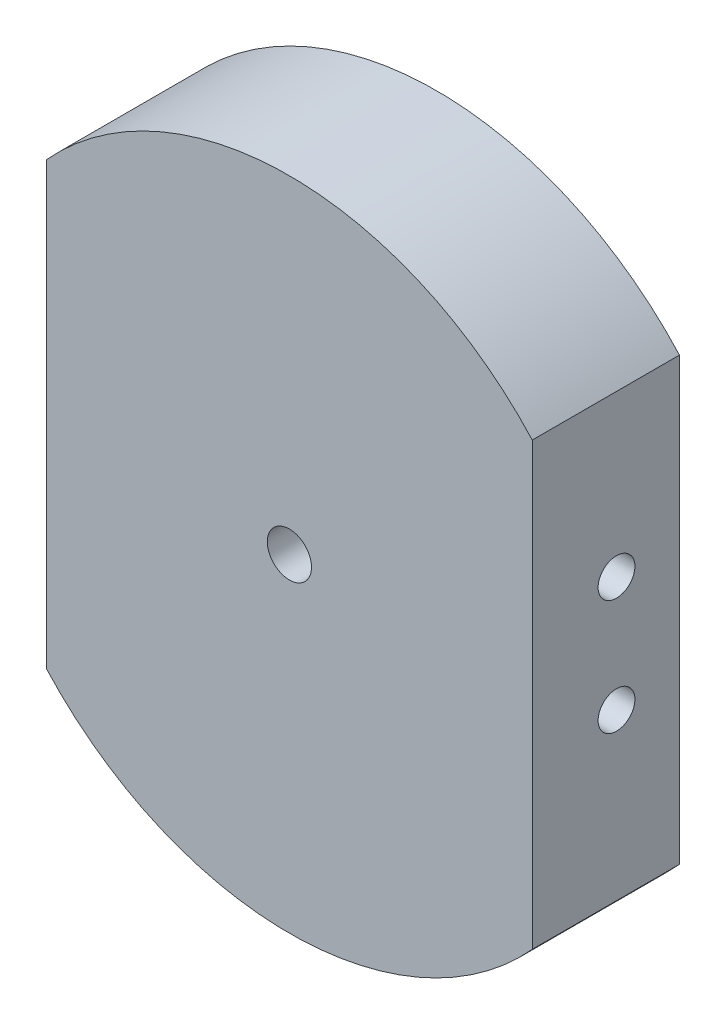
ISO-10303-21;
HEADER;
FILE_DESCRIPTION(('STEP AP214'),'2;1');
FILE_NAME('part.step','',(''),(''),'','','');
FILE_SCHEMA(('AUTOMOTIVE_DESIGN { 1 0 10303 214 1 1 1 1 }'));
ENDSEC;
DATA;
#1=APPLICATION_CONTEXT('core data for automotive mechanical design processes');
#2=APPLICATION_PROTOCOL_DEFINITION('international standard','automotive_design',2000,#1);
#3=PRODUCT_CONTEXT('',#1,'mechanical');
#4=PRODUCT('Part','Part','',(#3));
#5=PRODUCT_RELATED_PRODUCT_CATEGORY('part','',(#4));
#6=PRODUCT_DEFINITION_FORMATION('','',#4);
#7=PRODUCT_DEFINITION_CONTEXT('part definition',#1,'design');
#8=PRODUCT_DEFINITION('design','',#6,#7);
#9=PRODUCT_DEFINITION_SHAPE('','',#8);
#10=(LENGTH_UNIT() NAMED_UNIT(*) SI_UNIT(.MILLI.,.METRE.));
#11=(NAMED_UNIT(*) PLANE_ANGLE_UNIT() SI_UNIT($,.RADIAN.));
#12=(NAMED_UNIT(*) SI_UNIT($,.STERADIAN.) SOLID_ANGLE_UNIT());
#13=UNCERTAINTY_MEASURE_WITH_UNIT(LENGTH_MEASURE(1.E-05),#10,'distance_accuracy_value','');
#14=(GEOMETRIC_REPRESENTATION_CONTEXT(3) GLOBAL_UNCERTAINTY_ASSIGNED_CONTEXT((#13)) GLOBAL_UNIT_ASSIGNED_CONTEXT((#10,
#11,#12)) REPRESENTATION_CONTEXT('',''));
#15=CARTESIAN_POINT('',(0.,0.,0.));
#16=DIRECTION('',(0.,0.,1.));
#17=DIRECTION('',(1.,0.,0.));
#18=AXIS2_PLACEMENT_3D('',#15,#16,#17);
#19=CARTESIAN_POINT('',(0.,0.,0.));
#20=DIRECTION('',(0.,0.,1.));
#21=DIRECTION('',(1.,0.,0.));
#22=AXIS2_PLACEMENT_3D('',#19,#20,#21);
#23=PLANE('',#22);
#24=CARTESIAN_POINT('',(0.,0.,0.));
#25=DIRECTION('',(0.,0.,1.));
#26=DIRECTION('',(1.,0.,0.));
#27=AXIS2_PLACEMENT_3D('',#24,#25,#26);
#28=CIRCLE('',#27,3.);
#29=CARTESIAN_POINT('',(3.,0.,0.));
#30=VERTEX_POINT('',#29);
#31=EDGE_CURVE('E98',#30,#30,#28,.T.);
#32=ORIENTED_EDGE('',*,*,#31,.T.);
#33=EDGE_LOOP('',(#32));
#34=FACE_BOUND('',#33,.T.);
#35=CARTESIAN_POINT('',(0.,0.,0.));
#36=DIRECTION('',(0.,0.,1.));
#37=DIRECTION('',(1.,0.,0.));
#38=AXIS2_PLACEMENT_3D('',#35,#36,#37);
#39=CIRCLE('',#38,44.5764398015129);
#40=CARTESIAN_POINT('',(-33.,-29.9676322951597,0.));
#41=VERTEX_POINT('',#40);
#42=CARTESIAN_POINT('',(33.,-29.9676322951597,0.));
#43=VERTEX_POINT('',#42);
#44=EDGE_CURVE('E84',#41,#43,#39,.T.);
#45=ORIENTED_EDGE('',*,*,#44,.F.);
#46=DIRECTION('',(0.,-1.,0.));
#47=VECTOR('',#46,1.);
#48=CARTESIAN_POINT('',(-33.,0.,0.));
#49=LINE('',#48,#47);
#50=CARTESIAN_POINT('',(-33.,29.9676322951597,0.));
#51=VERTEX_POINT('',#50);
#52=EDGE_CURVE('E75',#51,#41,#49,.T.);
#53=ORIENTED_EDGE('',*,*,#52,.F.);
#54=CARTESIAN_POINT('',(0.,0.,0.));
#55=DIRECTION('',(0.,0.,1.));
#56=DIRECTION('',(1.,0.,0.));
#57=AXIS2_PLACEMENT_3D('',#54,#55,#56);
#58=CIRCLE('',#57,44.5764398015129);
#59=CARTESIAN_POINT('',(33.,29.9676322951597,0.));
#60=VERTEX_POINT('',#59);
#61=EDGE_CURVE('E83',#60,#51,#58,.T.);
#62=ORIENTED_EDGE('',*,*,#61,.F.);
#63=DIRECTION('',(0.,-1.,0.));
#64=VECTOR('',#63,1.);
#65=CARTESIAN_POINT('',(33.,0.,0.));
#66=LINE('',#65,#64);
#67=EDGE_CURVE('E56',#60,#43,#66,.T.);
#68=ORIENTED_EDGE('',*,*,#67,.T.);
#69=EDGE_LOOP('',(#45,#53,#62,#68));
#70=FACE_BOUND('',#69,.T.);
#71=ADVANCED_FACE('F33',(#34,#70),#23,.F.);
#72=CARTESIAN_POINT('',(0.,0.,20.));
#73=DIRECTION('',(0.,0.,1.));
#74=DIRECTION('',(1.,0.,0.));
#75=AXIS2_PLACEMENT_3D('',#72,#73,#74);
#76=PLANE('',#75);
#77=DIRECTION('',(0.,1.,0.));
#78=VECTOR('',#77,1.);
#79=CARTESIAN_POINT('',(-33.,0.,20.));
#80=LINE('',#79,#78);
#81=CARTESIAN_POINT('',(-33.,-29.9676322951597,20.));
#82=VERTEX_POINT('',#81);
#83=CARTESIAN_POINT('',(-33.,29.9676322951598,20.));
#84=VERTEX_POINT('',#83);
#85=EDGE_CURVE('E49',#82,#84,#80,.T.);
#86=ORIENTED_EDGE('',*,*,#85,.F.);
#87=CARTESIAN_POINT('',(0.,0.,20.));
#88=DIRECTION('',(0.,0.,1.));
#89=DIRECTION('',(1.,0.,0.));
#90=AXIS2_PLACEMENT_3D('',#87,#88,#89);
#91=CIRCLE('',#90,44.5764398015129);
#92=CARTESIAN_POINT('',(33.,-29.9676322951597,20.));
#93=VERTEX_POINT('',#92);
#94=EDGE_CURVE('E91',#82,#93,#91,.T.);
#95=ORIENTED_EDGE('',*,*,#94,.T.);
#96=DIRECTION('',(0.,1.,0.));
#97=VECTOR('',#96,1.);
#98=CARTESIAN_POINT('',(33.,0.,20.));
#99=LINE('',#98,#97);
#100=CARTESIAN_POINT('',(33.,29.9676322951597,20.));
#101=VERTEX_POINT('',#100);
#102=EDGE_CURVE('E93',#93,#101,#99,.T.);
#103=ORIENTED_EDGE('',*,*,#102,.T.);
#104=CARTESIAN_POINT('',(0.,0.,20.));
#105=DIRECTION('',(0.,0.,1.));
#106=DIRECTION('',(1.,0.,0.));
#107=AXIS2_PLACEMENT_3D('',#104,#105,#106);
#108=CIRCLE('',#107,44.5764398015129);
#109=EDGE_CURVE('E89',#84,#101,#108,.F.);
#110=ORIENTED_EDGE('',*,*,#109,.F.);
#111=EDGE_LOOP('',(#86,#95,#103,#110));
#112=FACE_BOUND('',#111,.T.);
#113=CARTESIAN_POINT('',(0.,0.,20.));
#114=DIRECTION('',(0.,0.,1.));
#115=DIRECTION('',(1.,0.,0.));
#116=AXIS2_PLACEMENT_3D('',#113,#114,#115);
#117=CIRCLE('',#116,3.);
#118=CARTESIAN_POINT('',(3.,0.,20.));
#119=VERTEX_POINT('',#118);
#120=EDGE_CURVE('E99',#119,#119,#117,.T.);
#121=ORIENTED_EDGE('',*,*,#120,.F.);
#122=EDGE_LOOP('',(#121));
#123=FACE_BOUND('',#122,.T.);
#124=ADVANCED_FACE('F123',(#112,#123),#76,.T.);
#125=CARTESIAN_POINT('',(0.,0.,10.));
#126=DIRECTION('',(0.,0.,1.));
#127=DIRECTION('',(1.,0.,0.));
#128=AXIS2_PLACEMENT_3D('',#125,#126,#127);
#129=CYLINDRICAL_SURFACE('',#128,44.5764398015129);
#130=DIRECTION('',(0.,0.,-1.));
#131=VECTOR('',#130,1.);
#132=CARTESIAN_POINT('',(-33.,-29.9676322951597,58.));
#133=LINE('',#132,#131);
#134=EDGE_CURVE('E85',#82,#41,#133,.T.);
#135=ORIENTED_EDGE('',*,*,#134,.T.);
#136=ORIENTED_EDGE('',*,*,#44,.T.);
#137=DIRECTION('',(0.,0.,-1.));
#138=VECTOR('',#137,1.);
#139=CARTESIAN_POINT('',(33.,-29.9676322951597,58.));
#140=LINE('',#139,#138);
#141=EDGE_CURVE('E119',#93,#43,#140,.T.);
#142=ORIENTED_EDGE('',*,*,#141,.F.);
#143=ORIENTED_EDGE('',*,*,#94,.F.);
#144=EDGE_LOOP('',(#135,#136,#142,#143));
#145=FACE_BOUND('',#144,.T.);
#146=ADVANCED_FACE('F129',(#145),#129,.T.);
#147=CARTESIAN_POINT('',(0.,0.,10.));
#148=DIRECTION('',(0.,0.,1.));
#149=DIRECTION('',(1.,0.,0.));
#150=AXIS2_PLACEMENT_3D('',#147,#148,#149);
#151=CYLINDRICAL_SURFACE('',#150,44.5764398015129);
#152=ORIENTED_EDGE('',*,*,#61,.T.);
#153=DIRECTION('',(0.,0.,1.));
#154=VECTOR('',#153,1.);
#155=CARTESIAN_POINT('',(-33.,29.9676322951598,10.));
#156=LINE('',#155,#154);
#157=EDGE_CURVE('E11',#51,#84,#156,.T.);
#158=ORIENTED_EDGE('',*,*,#157,.T.);
#159=ORIENTED_EDGE('',*,*,#109,.T.);
#160=DIRECTION('',(0.,0.,1.));
#161=VECTOR('',#160,1.);
#162=CARTESIAN_POINT('',(33.,29.9676322951598,10.));
#163=LINE('',#162,#161);
#164=EDGE_CURVE('E41',#60,#101,#163,.T.);
#165=ORIENTED_EDGE('',*,*,#164,.F.);
#166=EDGE_LOOP('',(#152,#158,#159,#165));
#167=FACE_BOUND('',#166,.T.);
#168=ADVANCED_FACE('F88',(#167),#151,.T.);
#169=CARTESIAN_POINT('',(0.,0.,20.));
#170=DIRECTION('',(0.,0.,-1.));
#171=DIRECTION('',(-1.,0.,0.));
#172=AXIS2_PLACEMENT_3D('',#169,#170,#171);
#173=CYLINDRICAL_SURFACE('',#172,3.);
#174=ORIENTED_EDGE('',*,*,#120,.T.);
#175=EDGE_LOOP('',(#174));
#176=FACE_BOUND('',#175,.T.);
#177=ORIENTED_EDGE('',*,*,#31,.F.);
#178=EDGE_LOOP('',(#177));
#179=FACE_BOUND('',#178,.T.);
#180=ADVANCED_FACE('F136',(#176,#179),#173,.F.);
#181=CARTESIAN_POINT('',(33.,0.,58.));
#182=DIRECTION('',(1.,0.,0.));
#183=DIRECTION('',(0.,0.,-1.));
#184=AXIS2_PLACEMENT_3D('',#181,#182,#183);
#185=PLANE('',#184);
#186=CARTESIAN_POINT('',(33.,8.13999999999987,8.55326289640541));
#187=DIRECTION('',(1.,0.,0.));
#188=DIRECTION('',(0.,0.,-1.));
#189=AXIS2_PLACEMENT_3D('',#186,#187,#188);
#190=CIRCLE('',#189,2.5);
#191=CARTESIAN_POINT('',(33.,8.13999999999987,6.05326289640541));
#192=VERTEX_POINT('',#191);
#193=EDGE_CURVE('E113',#192,#192,#190,.T.);
#194=ORIENTED_EDGE('',*,*,#193,.F.);
#195=EDGE_LOOP('',(#194));
#196=FACE_BOUND('',#195,.T.);
#197=CARTESIAN_POINT('',(33.,-7.51784370507938,8.55326289640541));
#198=DIRECTION('',(1.,0.,0.));
#199=DIRECTION('',(0.,0.,-1.));
#200=AXIS2_PLACEMENT_3D('',#197,#198,#199);
#201=CIRCLE('',#200,2.50000000000013);
#202=CARTESIAN_POINT('',(33.,-7.51784370507938,6.05326289640528));
#203=VERTEX_POINT('',#202);
#204=EDGE_CURVE('E105',#203,#203,#201,.T.);
#205=ORIENTED_EDGE('',*,*,#204,.F.);
#206=EDGE_LOOP('',(#205));
#207=FACE_BOUND('',#206,.T.);
#208=ORIENTED_EDGE('',*,*,#141,.T.);
#209=ORIENTED_EDGE('',*,*,#67,.F.);
#210=ORIENTED_EDGE('',*,*,#164,.T.);
#211=ORIENTED_EDGE('',*,*,#102,.F.);
#212=EDGE_LOOP('',(#208,#209,#210,#211));
#213=FACE_BOUND('',#212,.T.);
#214=ADVANCED_FACE('F127',(#196,#207,#213),#185,.T.);
#215=CARTESIAN_POINT('',(-33.,0.,58.));
#216=DIRECTION('',(1.,0.,0.));
#217=DIRECTION('',(0.,0.,-1.));
#218=AXIS2_PLACEMENT_3D('',#215,#216,#217);
#219=PLANE('',#218);
#220=CARTESIAN_POINT('',(-33.,8.13999999999987,8.55326289640541));
#221=DIRECTION('',(1.,0.,0.));
#222=DIRECTION('',(0.,0.,-1.));
#223=AXIS2_PLACEMENT_3D('',#220,#221,#222);
#224=CIRCLE('',#223,2.5);
#225=CARTESIAN_POINT('',(-33.,8.13999999999987,6.05326289640541));
#226=VERTEX_POINT('',#225);
#227=EDGE_CURVE('E36',#226,#226,#224,.T.);
#228=ORIENTED_EDGE('',*,*,#227,.T.);
#229=EDGE_LOOP('',(#228));
#230=FACE_BOUND('',#229,.T.);
#231=CARTESIAN_POINT('',(-33.,-7.51784370507938,8.55326289640541));
#232=DIRECTION('',(1.,0.,0.));
#233=DIRECTION('',(0.,0.,-1.));
#234=AXIS2_PLACEMENT_3D('',#231,#232,#233);
#235=CIRCLE('',#234,2.50000000000013);
#236=CARTESIAN_POINT('',(-33.,-7.51784370507938,6.05326289640528));
#237=VERTEX_POINT('',#236);
#238=EDGE_CURVE('E86',#237,#237,#235,.T.);
#239=ORIENTED_EDGE('',*,*,#238,.T.);
#240=EDGE_LOOP('',(#239));
#241=FACE_BOUND('',#240,.T.);
#242=ORIENTED_EDGE('',*,*,#85,.T.);
#243=ORIENTED_EDGE('',*,*,#157,.F.);
#244=ORIENTED_EDGE('',*,*,#52,.T.);
#245=ORIENTED_EDGE('',*,*,#134,.F.);
#246=EDGE_LOOP('',(#242,#243,#244,#245));
#247=FACE_BOUND('',#246,.T.);
#248=ADVANCED_FACE('F74',(#230,#241,#247),#219,.F.);
#249=CARTESIAN_POINT('',(-77.,-7.51784370507938,8.55326289640541));
#250=DIRECTION('',(1.,0.,0.));
#251=DIRECTION('',(0.,0.,-1.));
#252=AXIS2_PLACEMENT_3D('',#249,#250,#251);
#253=CYLINDRICAL_SURFACE('',#252,2.50000000000013);
#254=ORIENTED_EDGE('',*,*,#204,.T.);
#255=EDGE_LOOP('',(#254));
#256=FACE_BOUND('',#255,.T.);
#257=ORIENTED_EDGE('',*,*,#238,.F.);
#258=EDGE_LOOP('',(#257));
#259=FACE_BOUND('',#258,.T.);
#260=ADVANCED_FACE('F158',(#256,#259),#253,.F.);
#261=CARTESIAN_POINT('',(-77.,8.13999999999987,8.55326289640541));
#262=DIRECTION('',(1.,0.,0.));
#263=DIRECTION('',(0.,0.,-1.));
#264=AXIS2_PLACEMENT_3D('',#261,#262,#263);
#265=CYLINDRICAL_SURFACE('',#264,2.5);
#266=ORIENTED_EDGE('',*,*,#193,.T.);
#267=EDGE_LOOP('',(#266));
#268=FACE_BOUND('',#267,.T.);
#269=ORIENTED_EDGE('',*,*,#227,.F.);
#270=EDGE_LOOP('',(#269));
#271=FACE_BOUND('',#270,.T.);
#272=ADVANCED_FACE('F166',(#268,#271),#265,.F.);
#273=CLOSED_SHELL('',(#71,#124,#146,#168,#180,#214,#248,#260,#272));
#274=MANIFOLD_SOLID_BREP('B2',#273);
#275=ADVANCED_BREP_SHAPE_REPRESENTATION('',(#18,#274),#14);
#276=SHAPE_DEFINITION_REPRESENTATION(#9,#275);
ENDSEC;
END-ISO-10303-21;
